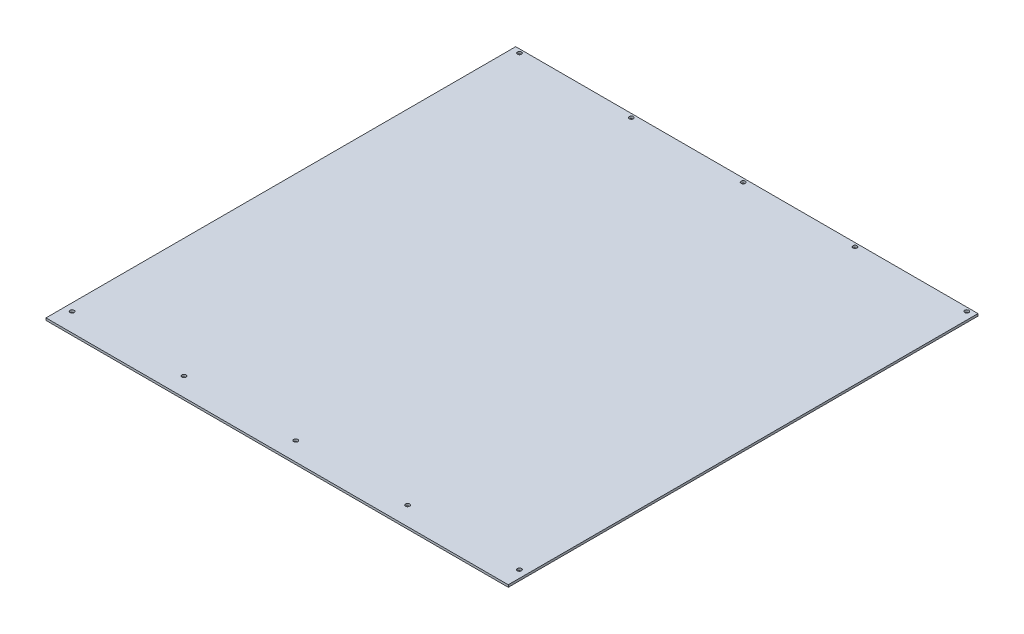
ISO-10303-21;
HEADER;
FILE_DESCRIPTION(('STEP AP214'),'2;1');
FILE_NAME('part.step','',(''),(''),'','','');
FILE_SCHEMA(('AUTOMOTIVE_DESIGN { 1 0 10303 214 1 1 1 1 }'));
ENDSEC;
DATA;
#1=APPLICATION_CONTEXT('core data for automotive mechanical design processes');
#2=APPLICATION_PROTOCOL_DEFINITION('international standard','automotive_design',2000,#1);
#3=PRODUCT_CONTEXT('',#1,'mechanical');
#4=PRODUCT('Part','Part','',(#3));
#5=PRODUCT_RELATED_PRODUCT_CATEGORY('part','',(#4));
#6=PRODUCT_DEFINITION_FORMATION('','',#4);
#7=PRODUCT_DEFINITION_CONTEXT('part definition',#1,'design');
#8=PRODUCT_DEFINITION('design','',#6,#7);
#9=PRODUCT_DEFINITION_SHAPE('','',#8);
#10=(LENGTH_UNIT() NAMED_UNIT(*) SI_UNIT(.MILLI.,.METRE.));
#11=(NAMED_UNIT(*) PLANE_ANGLE_UNIT() SI_UNIT($,.RADIAN.));
#12=(NAMED_UNIT(*) SI_UNIT($,.STERADIAN.) SOLID_ANGLE_UNIT());
#13=UNCERTAINTY_MEASURE_WITH_UNIT(LENGTH_MEASURE(1.E-05),#10,'distance_accuracy_value','');
#14=(GEOMETRIC_REPRESENTATION_CONTEXT(3) GLOBAL_UNCERTAINTY_ASSIGNED_CONTEXT((#13)) GLOBAL_UNIT_ASSIGNED_CONTEXT((#10,
#11,#12)) REPRESENTATION_CONTEXT('',''));
#15=CARTESIAN_POINT('',(0.,0.,0.));
#16=DIRECTION('',(0.,0.,1.));
#17=DIRECTION('',(1.,0.,0.));
#18=AXIS2_PLACEMENT_3D('',#15,#16,#17);
#19=CARTESIAN_POINT('',(600.,151.,650.));
#20=DIRECTION('',(0.,1.,0.));
#21=DIRECTION('',(0.,0.,1.));
#22=AXIS2_PLACEMENT_3D('',#19,#20,#21);
#23=CYLINDRICAL_SURFACE('',#22,2.75);
#24=CARTESIAN_POINT('',(600.,155.,650.));
#25=DIRECTION('',(0.,1.,0.));
#26=DIRECTION('',(0.,0.,1.));
#27=AXIS2_PLACEMENT_3D('',#24,#25,#26);
#28=CIRCLE('',#27,2.75);
#29=CARTESIAN_POINT('',(600.,155.,652.75));
#30=VERTEX_POINT('',#29);
#31=EDGE_CURVE('E25',#30,#30,#28,.T.);
#32=ORIENTED_EDGE('',*,*,#31,.T.);
#33=EDGE_LOOP('',(#32));
#34=FACE_BOUND('',#33,.T.);
#35=CARTESIAN_POINT('',(600.,152.,650.));
#36=DIRECTION('',(0.,1.,0.));
#37=DIRECTION('',(0.,0.,1.));
#38=AXIS2_PLACEMENT_3D('',#35,#36,#37);
#39=CIRCLE('',#38,2.75);
#40=CARTESIAN_POINT('',(600.,152.,652.75));
#41=VERTEX_POINT('',#40);
#42=EDGE_CURVE('E155',#41,#41,#39,.T.);
#43=ORIENTED_EDGE('',*,*,#42,.F.);
#44=EDGE_LOOP('',(#43));
#45=FACE_BOUND('',#44,.T.);
#46=ADVANCED_FACE('F16',(#34,#45),#23,.F.);
#47=CARTESIAN_POINT('',(450.,151.,650.));
#48=DIRECTION('',(0.,1.,0.));
#49=DIRECTION('',(0.,0.,1.));
#50=AXIS2_PLACEMENT_3D('',#47,#48,#49);
#51=CYLINDRICAL_SURFACE('',#50,2.75);
#52=CARTESIAN_POINT('',(450.,155.,650.));
#53=DIRECTION('',(0.,1.,0.));
#54=DIRECTION('',(0.,0.,1.));
#55=AXIS2_PLACEMENT_3D('',#52,#53,#54);
#56=CIRCLE('',#55,2.75);
#57=CARTESIAN_POINT('',(450.,155.,652.75));
#58=VERTEX_POINT('',#57);
#59=EDGE_CURVE('E190',#58,#58,#56,.T.);
#60=ORIENTED_EDGE('',*,*,#59,.T.);
#61=EDGE_LOOP('',(#60));
#62=FACE_BOUND('',#61,.T.);
#63=CARTESIAN_POINT('',(450.,152.,650.));
#64=DIRECTION('',(0.,1.,0.));
#65=DIRECTION('',(0.,0.,1.));
#66=AXIS2_PLACEMENT_3D('',#63,#64,#65);
#67=CIRCLE('',#66,2.75);
#68=CARTESIAN_POINT('',(450.,152.,652.75));
#69=VERTEX_POINT('',#68);
#70=EDGE_CURVE('E124',#69,#69,#67,.T.);
#71=ORIENTED_EDGE('',*,*,#70,.F.);
#72=EDGE_LOOP('',(#71));
#73=FACE_BOUND('',#72,.T.);
#74=ADVANCED_FACE('F18',(#62,#73),#51,.F.);
#75=CARTESIAN_POINT('',(300.,151.,650.));
#76=DIRECTION('',(0.,1.,0.));
#77=DIRECTION('',(0.,0.,1.));
#78=AXIS2_PLACEMENT_3D('',#75,#76,#77);
#79=CYLINDRICAL_SURFACE('',#78,2.75);
#80=CARTESIAN_POINT('',(300.,155.,650.));
#81=DIRECTION('',(0.,1.,0.));
#82=DIRECTION('',(0.,0.,1.));
#83=AXIS2_PLACEMENT_3D('',#80,#81,#82);
#84=CIRCLE('',#83,2.75);
#85=CARTESIAN_POINT('',(300.,155.,652.75));
#86=VERTEX_POINT('',#85);
#87=EDGE_CURVE('E186',#86,#86,#84,.T.);
#88=ORIENTED_EDGE('',*,*,#87,.T.);
#89=EDGE_LOOP('',(#88));
#90=FACE_BOUND('',#89,.T.);
#91=CARTESIAN_POINT('',(300.,152.,650.));
#92=DIRECTION('',(0.,1.,0.));
#93=DIRECTION('',(0.,0.,1.));
#94=AXIS2_PLACEMENT_3D('',#91,#92,#93);
#95=CIRCLE('',#94,2.75);
#96=CARTESIAN_POINT('',(300.,152.,652.75));
#97=VERTEX_POINT('',#96);
#98=EDGE_CURVE('E120',#97,#97,#95,.T.);
#99=ORIENTED_EDGE('',*,*,#98,.F.);
#100=EDGE_LOOP('',(#99));
#101=FACE_BOUND('',#100,.T.);
#102=ADVANCED_FACE('F243',(#90,#101),#79,.F.);
#103=CARTESIAN_POINT('',(600.,151.,50.));
#104=DIRECTION('',(0.,1.,0.));
#105=DIRECTION('',(0.,0.,1.));
#106=AXIS2_PLACEMENT_3D('',#103,#104,#105);
#107=CYLINDRICAL_SURFACE('',#106,2.75);
#108=CARTESIAN_POINT('',(600.,155.,50.));
#109=DIRECTION('',(0.,1.,0.));
#110=DIRECTION('',(0.,0.,1.));
#111=AXIS2_PLACEMENT_3D('',#108,#109,#110);
#112=CIRCLE('',#111,2.75);
#113=CARTESIAN_POINT('',(600.,155.,52.75));
#114=VERTEX_POINT('',#113);
#115=EDGE_CURVE('E105',#114,#114,#112,.T.);
#116=ORIENTED_EDGE('',*,*,#115,.T.);
#117=EDGE_LOOP('',(#116));
#118=FACE_BOUND('',#117,.T.);
#119=CARTESIAN_POINT('',(600.,152.,50.));
#120=DIRECTION('',(0.,1.,0.));
#121=DIRECTION('',(0.,0.,1.));
#122=AXIS2_PLACEMENT_3D('',#119,#120,#121);
#123=CIRCLE('',#122,2.75);
#124=CARTESIAN_POINT('',(600.,152.,52.75));
#125=VERTEX_POINT('',#124);
#126=EDGE_CURVE('E125',#125,#125,#123,.T.);
#127=ORIENTED_EDGE('',*,*,#126,.F.);
#128=EDGE_LOOP('',(#127));
#129=FACE_BOUND('',#128,.T.);
#130=ADVANCED_FACE('F341',(#118,#129),#107,.F.);
#131=CARTESIAN_POINT('',(450.,151.,50.));
#132=DIRECTION('',(0.,1.,0.));
#133=DIRECTION('',(0.,0.,1.));
#134=AXIS2_PLACEMENT_3D('',#131,#132,#133);
#135=CYLINDRICAL_SURFACE('',#134,2.75);
#136=CARTESIAN_POINT('',(450.,155.,50.));
#137=DIRECTION('',(0.,1.,0.));
#138=DIRECTION('',(0.,0.,1.));
#139=AXIS2_PLACEMENT_3D('',#136,#137,#138);
#140=CIRCLE('',#139,2.75);
#141=CARTESIAN_POINT('',(450.,155.,52.75));
#142=VERTEX_POINT('',#141);
#143=EDGE_CURVE('E102',#142,#142,#140,.T.);
#144=ORIENTED_EDGE('',*,*,#143,.T.);
#145=EDGE_LOOP('',(#144));
#146=FACE_BOUND('',#145,.T.);
#147=CARTESIAN_POINT('',(450.,152.,50.));
#148=DIRECTION('',(0.,1.,0.));
#149=DIRECTION('',(0.,0.,1.));
#150=AXIS2_PLACEMENT_3D('',#147,#148,#149);
#151=CIRCLE('',#150,2.75);
#152=CARTESIAN_POINT('',(450.,152.,52.75));
#153=VERTEX_POINT('',#152);
#154=EDGE_CURVE('E126',#153,#153,#151,.T.);
#155=ORIENTED_EDGE('',*,*,#154,.F.);
#156=EDGE_LOOP('',(#155));
#157=FACE_BOUND('',#156,.T.);
#158=ADVANCED_FACE('F331',(#146,#157),#135,.F.);
#159=CARTESIAN_POINT('',(300.,151.,50.));
#160=DIRECTION('',(0.,1.,0.));
#161=DIRECTION('',(0.,0.,1.));
#162=AXIS2_PLACEMENT_3D('',#159,#160,#161);
#163=CYLINDRICAL_SURFACE('',#162,2.75);
#164=CARTESIAN_POINT('',(300.,155.,50.));
#165=DIRECTION('',(0.,1.,0.));
#166=DIRECTION('',(0.,0.,1.));
#167=AXIS2_PLACEMENT_3D('',#164,#165,#166);
#168=CIRCLE('',#167,2.75);
#169=CARTESIAN_POINT('',(300.,155.,52.75));
#170=VERTEX_POINT('',#169);
#171=EDGE_CURVE('E106',#170,#170,#168,.T.);
#172=ORIENTED_EDGE('',*,*,#171,.T.);
#173=EDGE_LOOP('',(#172));
#174=FACE_BOUND('',#173,.T.);
#175=CARTESIAN_POINT('',(300.,152.,50.));
#176=DIRECTION('',(0.,1.,0.));
#177=DIRECTION('',(0.,0.,1.));
#178=AXIS2_PLACEMENT_3D('',#175,#176,#177);
#179=CIRCLE('',#178,2.75);
#180=CARTESIAN_POINT('',(300.,152.,52.75));
#181=VERTEX_POINT('',#180);
#182=EDGE_CURVE('E114',#181,#181,#179,.T.);
#183=ORIENTED_EDGE('',*,*,#182,.F.);
#184=EDGE_LOOP('',(#183));
#185=FACE_BOUND('',#184,.T.);
#186=ADVANCED_FACE('F255',(#174,#185),#163,.F.);
#187=CARTESIAN_POINT('',(150.,151.,650.));
#188=DIRECTION('',(0.,1.,0.));
#189=DIRECTION('',(0.,0.,1.));
#190=AXIS2_PLACEMENT_3D('',#187,#188,#189);
#191=CYLINDRICAL_SURFACE('',#190,2.75);
#192=CARTESIAN_POINT('',(150.,155.,650.));
#193=DIRECTION('',(0.,1.,0.));
#194=DIRECTION('',(0.,0.,1.));
#195=AXIS2_PLACEMENT_3D('',#192,#193,#194);
#196=CIRCLE('',#195,2.75);
#197=CARTESIAN_POINT('',(150.,155.,652.75));
#198=VERTEX_POINT('',#197);
#199=EDGE_CURVE('E130',#198,#198,#196,.T.);
#200=ORIENTED_EDGE('',*,*,#199,.T.);
#201=EDGE_LOOP('',(#200));
#202=FACE_BOUND('',#201,.T.);
#203=CARTESIAN_POINT('',(150.,152.,650.));
#204=DIRECTION('',(0.,1.,0.));
#205=DIRECTION('',(0.,0.,1.));
#206=AXIS2_PLACEMENT_3D('',#203,#204,#205);
#207=CIRCLE('',#206,2.75);
#208=CARTESIAN_POINT('',(150.,152.,652.75));
#209=VERTEX_POINT('',#208);
#210=EDGE_CURVE('E111',#209,#209,#207,.T.);
#211=ORIENTED_EDGE('',*,*,#210,.F.);
#212=EDGE_LOOP('',(#211));
#213=FACE_BOUND('',#212,.T.);
#214=ADVANCED_FACE('F251',(#202,#213),#191,.F.);
#215=CARTESIAN_POINT('',(0.,151.,650.));
#216=DIRECTION('',(0.,1.,0.));
#217=DIRECTION('',(0.,0.,1.));
#218=AXIS2_PLACEMENT_3D('',#215,#216,#217);
#219=CYLINDRICAL_SURFACE('',#218,2.75);
#220=CARTESIAN_POINT('',(0.,155.,650.));
#221=DIRECTION('',(0.,1.,0.));
#222=DIRECTION('',(0.,0.,1.));
#223=AXIS2_PLACEMENT_3D('',#220,#221,#222);
#224=CIRCLE('',#223,2.75);
#225=CARTESIAN_POINT('',(0.,155.,652.75));
#226=VERTEX_POINT('',#225);
#227=EDGE_CURVE('E134',#226,#226,#224,.T.);
#228=ORIENTED_EDGE('',*,*,#227,.T.);
#229=EDGE_LOOP('',(#228));
#230=FACE_BOUND('',#229,.T.);
#231=CARTESIAN_POINT('',(0.,152.,650.));
#232=DIRECTION('',(0.,1.,0.));
#233=DIRECTION('',(0.,0.,1.));
#234=AXIS2_PLACEMENT_3D('',#231,#232,#233);
#235=CIRCLE('',#234,2.75);
#236=CARTESIAN_POINT('',(0.,152.,652.75));
#237=VERTEX_POINT('',#236);
#238=EDGE_CURVE('E115',#237,#237,#235,.T.);
#239=ORIENTED_EDGE('',*,*,#238,.F.);
#240=EDGE_LOOP('',(#239));
#241=FACE_BOUND('',#240,.T.);
#242=ADVANCED_FACE('F254',(#230,#241),#219,.F.);
#243=CARTESIAN_POINT('',(150.,151.,50.));
#244=DIRECTION('',(0.,1.,0.));
#245=DIRECTION('',(0.,0.,1.));
#246=AXIS2_PLACEMENT_3D('',#243,#244,#245);
#247=CYLINDRICAL_SURFACE('',#246,2.75);
#248=CARTESIAN_POINT('',(150.,155.,50.));
#249=DIRECTION('',(0.,1.,0.));
#250=DIRECTION('',(0.,0.,1.));
#251=AXIS2_PLACEMENT_3D('',#248,#249,#250);
#252=CIRCLE('',#251,2.75);
#253=CARTESIAN_POINT('',(150.,155.,52.75));
#254=VERTEX_POINT('',#253);
#255=EDGE_CURVE('E173',#254,#254,#252,.T.);
#256=ORIENTED_EDGE('',*,*,#255,.T.);
#257=EDGE_LOOP('',(#256));
#258=FACE_BOUND('',#257,.T.);
#259=CARTESIAN_POINT('',(150.,152.,50.));
#260=DIRECTION('',(0.,1.,0.));
#261=DIRECTION('',(0.,0.,1.));
#262=AXIS2_PLACEMENT_3D('',#259,#260,#261);
#263=CIRCLE('',#262,2.75);
#264=CARTESIAN_POINT('',(150.,152.,52.75));
#265=VERTEX_POINT('',#264);
#266=EDGE_CURVE('E138',#265,#265,#263,.T.);
#267=ORIENTED_EDGE('',*,*,#266,.F.);
#268=EDGE_LOOP('',(#267));
#269=FACE_BOUND('',#268,.T.);
#270=ADVANCED_FACE('F234',(#258,#269),#247,.F.);
#271=CARTESIAN_POINT('',(0.,151.,50.));
#272=DIRECTION('',(0.,1.,0.));
#273=DIRECTION('',(0.,0.,1.));
#274=AXIS2_PLACEMENT_3D('',#271,#272,#273);
#275=CYLINDRICAL_SURFACE('',#274,2.75);
#276=CARTESIAN_POINT('',(0.,155.,50.));
#277=DIRECTION('',(0.,1.,0.));
#278=DIRECTION('',(0.,0.,1.));
#279=AXIS2_PLACEMENT_3D('',#276,#277,#278);
#280=CIRCLE('',#279,2.75);
#281=CARTESIAN_POINT('',(0.,155.,52.75));
#282=VERTEX_POINT('',#281);
#283=EDGE_CURVE('E144',#282,#282,#280,.T.);
#284=ORIENTED_EDGE('',*,*,#283,.T.);
#285=EDGE_LOOP('',(#284));
#286=FACE_BOUND('',#285,.T.);
#287=CARTESIAN_POINT('',(0.,152.,50.));
#288=DIRECTION('',(0.,1.,0.));
#289=DIRECTION('',(0.,0.,1.));
#290=AXIS2_PLACEMENT_3D('',#287,#288,#289);
#291=CIRCLE('',#290,2.75);
#292=CARTESIAN_POINT('',(0.,152.,52.75));
#293=VERTEX_POINT('',#292);
#294=EDGE_CURVE('E119',#293,#293,#291,.T.);
#295=ORIENTED_EDGE('',*,*,#294,.F.);
#296=EDGE_LOOP('',(#295));
#297=FACE_BOUND('',#296,.T.);
#298=ADVANCED_FACE('F226',(#286,#297),#275,.F.);
#299=CARTESIAN_POINT('',(610.,152.,45.));
#300=DIRECTION('',(1.,0.,0.));
#301=DIRECTION('',(0.,1.,0.));
#302=AXIS2_PLACEMENT_3D('',#299,#300,#301);
#303=PLANE('',#302);
#304=DIRECTION('',(0.,0.,1.));
#305=VECTOR('',#304,1.);
#306=CARTESIAN_POINT('',(610.,152.,45.));
#307=LINE('',#306,#305);
#308=CARTESIAN_POINT('',(610.,152.,45.));
#309=VERTEX_POINT('',#308);
#310=CARTESIAN_POINT('',(610.,152.,675.));
#311=VERTEX_POINT('',#310);
#312=EDGE_CURVE('E75',#309,#311,#307,.T.);
#313=ORIENTED_EDGE('',*,*,#312,.F.);
#314=DIRECTION('',(0.,1.,0.));
#315=VECTOR('',#314,1.);
#316=CARTESIAN_POINT('',(610.,152.,45.));
#317=LINE('',#316,#315);
#318=CARTESIAN_POINT('',(610.,155.,45.));
#319=VERTEX_POINT('',#318);
#320=EDGE_CURVE('E10',#309,#319,#317,.T.);
#321=ORIENTED_EDGE('',*,*,#320,.T.);
#322=DIRECTION('',(0.,0.,1.));
#323=VECTOR('',#322,1.);
#324=CARTESIAN_POINT('',(610.,155.,45.));
#325=LINE('',#324,#323);
#326=CARTESIAN_POINT('',(610.,155.,675.));
#327=VERTEX_POINT('',#326);
#328=EDGE_CURVE('E43',#319,#327,#325,.T.);
#329=ORIENTED_EDGE('',*,*,#328,.T.);
#330=DIRECTION('',(0.,1.,0.));
#331=VECTOR('',#330,1.);
#332=CARTESIAN_POINT('',(610.,152.,675.));
#333=LINE('',#332,#331);
#334=EDGE_CURVE('E159',#311,#327,#333,.T.);
#335=ORIENTED_EDGE('',*,*,#334,.F.);
#336=EDGE_LOOP('',(#313,#321,#329,#335));
#337=FACE_BOUND('',#336,.T.);
#338=ADVANCED_FACE('F224',(#337),#303,.T.);
#339=CARTESIAN_POINT('',(-10.,152.,45.));
#340=DIRECTION('',(0.,0.,1.));
#341=DIRECTION('',(1.,0.,0.));
#342=AXIS2_PLACEMENT_3D('',#339,#340,#341);
#343=PLANE('',#342);
#344=DIRECTION('',(1.,0.,0.));
#345=VECTOR('',#344,1.);
#346=CARTESIAN_POINT('',(-10.,155.,45.));
#347=LINE('',#346,#345);
#348=CARTESIAN_POINT('',(-10.,155.,45.));
#349=VERTEX_POINT('',#348);
#350=EDGE_CURVE('E145',#349,#319,#347,.T.);
#351=ORIENTED_EDGE('',*,*,#350,.T.);
#352=ORIENTED_EDGE('',*,*,#320,.F.);
#353=DIRECTION('',(1.,0.,0.));
#354=VECTOR('',#353,1.);
#355=CARTESIAN_POINT('',(-10.,152.,45.));
#356=LINE('',#355,#354);
#357=CARTESIAN_POINT('',(-10.,152.,45.));
#358=VERTEX_POINT('',#357);
#359=EDGE_CURVE('E80',#358,#309,#356,.T.);
#360=ORIENTED_EDGE('',*,*,#359,.F.);
#361=DIRECTION('',(0.,1.,0.));
#362=VECTOR('',#361,1.);
#363=CARTESIAN_POINT('',(-10.,152.,45.));
#364=LINE('',#363,#362);
#365=EDGE_CURVE('E88',#358,#349,#364,.T.);
#366=ORIENTED_EDGE('',*,*,#365,.T.);
#367=EDGE_LOOP('',(#351,#352,#360,#366));
#368=FACE_BOUND('',#367,.T.);
#369=ADVANCED_FACE('F203',(#368),#343,.F.);
#370=CARTESIAN_POINT('',(-10.,155.,45.));
#371=DIRECTION('',(0.,1.,0.));
#372=DIRECTION('',(1.,0.,0.));
#373=AXIS2_PLACEMENT_3D('',#370,#371,#372);
#374=PLANE('',#373);
#375=ORIENTED_EDGE('',*,*,#31,.F.);
#376=EDGE_LOOP('',(#375));
#377=FACE_BOUND('',#376,.T.);
#378=ORIENTED_EDGE('',*,*,#59,.F.);
#379=EDGE_LOOP('',(#378));
#380=FACE_BOUND('',#379,.T.);
#381=ORIENTED_EDGE('',*,*,#87,.F.);
#382=EDGE_LOOP('',(#381));
#383=FACE_BOUND('',#382,.T.);
#384=ORIENTED_EDGE('',*,*,#115,.F.);
#385=EDGE_LOOP('',(#384));
#386=FACE_BOUND('',#385,.T.);
#387=ORIENTED_EDGE('',*,*,#143,.F.);
#388=EDGE_LOOP('',(#387));
#389=FACE_BOUND('',#388,.T.);
#390=ORIENTED_EDGE('',*,*,#171,.F.);
#391=EDGE_LOOP('',(#390));
#392=FACE_BOUND('',#391,.T.);
#393=ORIENTED_EDGE('',*,*,#199,.F.);
#394=EDGE_LOOP('',(#393));
#395=FACE_BOUND('',#394,.T.);
#396=ORIENTED_EDGE('',*,*,#227,.F.);
#397=EDGE_LOOP('',(#396));
#398=FACE_BOUND('',#397,.T.);
#399=ORIENTED_EDGE('',*,*,#255,.F.);
#400=EDGE_LOOP('',(#399));
#401=FACE_BOUND('',#400,.T.);
#402=ORIENTED_EDGE('',*,*,#283,.F.);
#403=EDGE_LOOP('',(#402));
#404=FACE_BOUND('',#403,.T.);
#405=ORIENTED_EDGE('',*,*,#350,.F.);
#406=DIRECTION('',(0.,0.,1.));
#407=VECTOR('',#406,1.);
#408=CARTESIAN_POINT('',(-10.,155.,45.));
#409=LINE('',#408,#407);
#410=CARTESIAN_POINT('',(-10.,155.,675.));
#411=VERTEX_POINT('',#410);
#412=EDGE_CURVE('E95',#349,#411,#409,.T.);
#413=ORIENTED_EDGE('',*,*,#412,.T.);
#414=DIRECTION('',(1.,0.,0.));
#415=VECTOR('',#414,1.);
#416=CARTESIAN_POINT('',(-10.,155.,675.));
#417=LINE('',#416,#415);
#418=EDGE_CURVE('E92',#411,#327,#417,.T.);
#419=ORIENTED_EDGE('',*,*,#418,.T.);
#420=ORIENTED_EDGE('',*,*,#328,.F.);
#421=EDGE_LOOP('',(#405,#413,#419,#420));
#422=FACE_BOUND('',#421,.T.);
#423=ADVANCED_FACE('F200',(#377,#380,#383,#386,#389,#392,#395,#398,#401,#404,#422),#374,.T.);
#424=CARTESIAN_POINT('',(-10.,152.,675.));
#425=DIRECTION('',(0.,0.,1.));
#426=DIRECTION('',(1.,0.,0.));
#427=AXIS2_PLACEMENT_3D('',#424,#425,#426);
#428=PLANE('',#427);
#429=DIRECTION('',(0.,1.,0.));
#430=VECTOR('',#429,1.);
#431=CARTESIAN_POINT('',(-10.,152.,675.));
#432=LINE('',#431,#430);
#433=CARTESIAN_POINT('',(-10.,152.,675.));
#434=VERTEX_POINT('',#433);
#435=EDGE_CURVE('E86',#434,#411,#432,.T.);
#436=ORIENTED_EDGE('',*,*,#435,.F.);
#437=DIRECTION('',(1.,0.,0.));
#438=VECTOR('',#437,1.);
#439=CARTESIAN_POINT('',(-10.,152.,675.));
#440=LINE('',#439,#438);
#441=EDGE_CURVE('E69',#434,#311,#440,.T.);
#442=ORIENTED_EDGE('',*,*,#441,.T.);
#443=ORIENTED_EDGE('',*,*,#334,.T.);
#444=ORIENTED_EDGE('',*,*,#418,.F.);
#445=EDGE_LOOP('',(#436,#442,#443,#444));
#446=FACE_BOUND('',#445,.T.);
#447=ADVANCED_FACE('F91',(#446),#428,.T.);
#448=CARTESIAN_POINT('',(-10.,152.,45.));
#449=DIRECTION('',(0.,1.,0.));
#450=DIRECTION('',(1.,0.,0.));
#451=AXIS2_PLACEMENT_3D('',#448,#449,#450);
#452=PLANE('',#451);
#453=ORIENTED_EDGE('',*,*,#42,.T.);
#454=EDGE_LOOP('',(#453));
#455=FACE_BOUND('',#454,.T.);
#456=ORIENTED_EDGE('',*,*,#70,.T.);
#457=EDGE_LOOP('',(#456));
#458=FACE_BOUND('',#457,.T.);
#459=ORIENTED_EDGE('',*,*,#98,.T.);
#460=EDGE_LOOP('',(#459));
#461=FACE_BOUND('',#460,.T.);
#462=ORIENTED_EDGE('',*,*,#126,.T.);
#463=EDGE_LOOP('',(#462));
#464=FACE_BOUND('',#463,.T.);
#465=ORIENTED_EDGE('',*,*,#154,.T.);
#466=EDGE_LOOP('',(#465));
#467=FACE_BOUND('',#466,.T.);
#468=ORIENTED_EDGE('',*,*,#182,.T.);
#469=EDGE_LOOP('',(#468));
#470=FACE_BOUND('',#469,.T.);
#471=ORIENTED_EDGE('',*,*,#210,.T.);
#472=EDGE_LOOP('',(#471));
#473=FACE_BOUND('',#472,.T.);
#474=ORIENTED_EDGE('',*,*,#238,.T.);
#475=EDGE_LOOP('',(#474));
#476=FACE_BOUND('',#475,.T.);
#477=ORIENTED_EDGE('',*,*,#266,.T.);
#478=EDGE_LOOP('',(#477));
#479=FACE_BOUND('',#478,.T.);
#480=ORIENTED_EDGE('',*,*,#294,.T.);
#481=EDGE_LOOP('',(#480));
#482=FACE_BOUND('',#481,.T.);
#483=ORIENTED_EDGE('',*,*,#312,.T.);
#484=ORIENTED_EDGE('',*,*,#441,.F.);
#485=DIRECTION('',(0.,0.,1.));
#486=VECTOR('',#485,1.);
#487=CARTESIAN_POINT('',(-10.,152.,45.));
#488=LINE('',#487,#486);
#489=EDGE_CURVE('E73',#358,#434,#488,.T.);
#490=ORIENTED_EDGE('',*,*,#489,.F.);
#491=ORIENTED_EDGE('',*,*,#359,.T.);
#492=EDGE_LOOP('',(#483,#484,#490,#491));
#493=FACE_BOUND('',#492,.T.);
#494=ADVANCED_FACE('F71',(#455,#458,#461,#464,#467,#470,#473,#476,#479,#482,#493),#452,.F.);
#495=CARTESIAN_POINT('',(-10.,152.,45.));
#496=DIRECTION('',(1.,0.,0.));
#497=DIRECTION('',(0.,1.,0.));
#498=AXIS2_PLACEMENT_3D('',#495,#496,#497);
#499=PLANE('',#498);
#500=ORIENTED_EDGE('',*,*,#435,.T.);
#501=ORIENTED_EDGE('',*,*,#412,.F.);
#502=ORIENTED_EDGE('',*,*,#365,.F.);
#503=ORIENTED_EDGE('',*,*,#489,.T.);
#504=EDGE_LOOP('',(#500,#501,#502,#503));
#505=FACE_BOUND('',#504,.T.);
#506=ADVANCED_FACE('F84',(#505),#499,.F.);
#507=CLOSED_SHELL('',(#46,#74,#102,#130,#158,#186,#214,#242,#270,#298,#338,#369,#423,#447,#494,#506));
#508=MANIFOLD_SOLID_BREP('B1',#507);
#509=ADVANCED_BREP_SHAPE_REPRESENTATION('',(#18,#508),#14);
#510=SHAPE_DEFINITION_REPRESENTATION(#9,#509);
ENDSEC;
END-ISO-10303-21;
